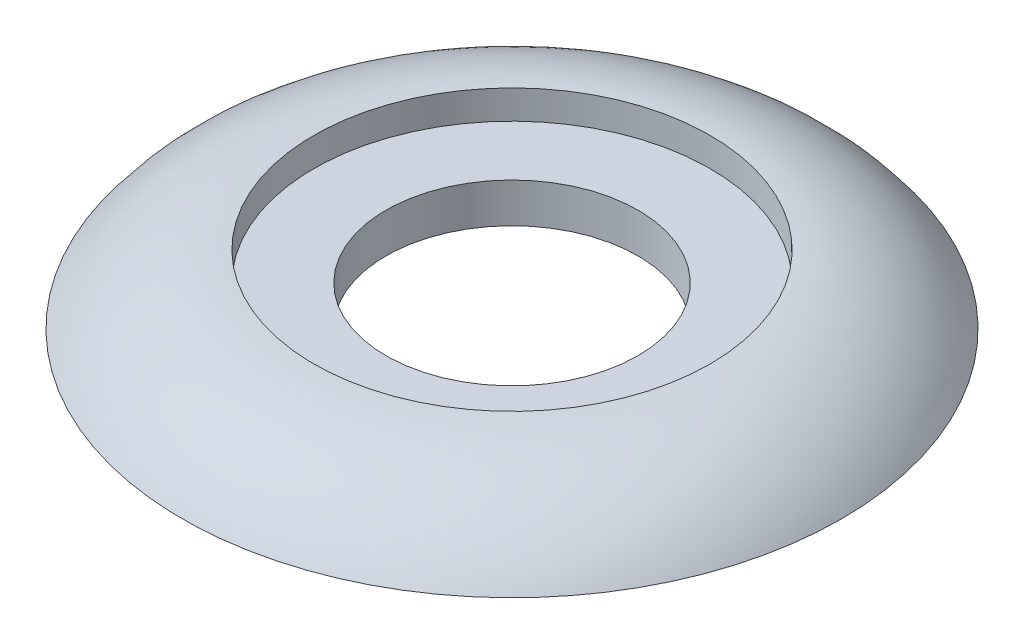
ISO-10303-21;
HEADER;
FILE_DESCRIPTION(('STEP AP214'),'2;1');
FILE_NAME('part.step','',(''),(''),'','','');
FILE_SCHEMA(('AUTOMOTIVE_DESIGN { 1 0 10303 214 1 1 1 1 }'));
ENDSEC;
DATA;
#1=APPLICATION_CONTEXT('core data for automotive mechanical design processes');
#2=APPLICATION_PROTOCOL_DEFINITION('international standard','automotive_design',2000,#1);
#3=PRODUCT_CONTEXT('',#1,'mechanical');
#4=PRODUCT('Part','Part','',(#3));
#5=PRODUCT_RELATED_PRODUCT_CATEGORY('part','',(#4));
#6=PRODUCT_DEFINITION_FORMATION('','',#4);
#7=PRODUCT_DEFINITION_CONTEXT('part definition',#1,'design');
#8=PRODUCT_DEFINITION('design','',#6,#7);
#9=PRODUCT_DEFINITION_SHAPE('','',#8);
#10=(LENGTH_UNIT() NAMED_UNIT(*) SI_UNIT(.MILLI.,.METRE.));
#11=(NAMED_UNIT(*) PLANE_ANGLE_UNIT() SI_UNIT($,.RADIAN.));
#12=(NAMED_UNIT(*) SI_UNIT($,.STERADIAN.) SOLID_ANGLE_UNIT());
#13=UNCERTAINTY_MEASURE_WITH_UNIT(LENGTH_MEASURE(1.E-05),#10,'distance_accuracy_value','');
#14=(GEOMETRIC_REPRESENTATION_CONTEXT(3) GLOBAL_UNCERTAINTY_ASSIGNED_CONTEXT((#13)) GLOBAL_UNIT_ASSIGNED_CONTEXT((#10,
#11,#12)) REPRESENTATION_CONTEXT('',''));
#15=CARTESIAN_POINT('',(0.,0.,0.));
#16=DIRECTION('',(0.,0.,1.));
#17=DIRECTION('',(1.,0.,0.));
#18=AXIS2_PLACEMENT_3D('',#15,#16,#17);
#19=CARTESIAN_POINT('',(1.36312068222548E-12,-397.382429866827,0.));
#20=DIRECTION('',(0.,-1.,0.));
#21=DIRECTION('',(1.,0.,0.));
#22=AXIS2_PLACEMENT_3D('',#19,#20,#21);
#23=CYLINDRICAL_SURFACE('',#22,4.445);
#24=CARTESIAN_POINT('',(0.,0.,0.));
#25=DIRECTION('',(0.,-1.,0.));
#26=DIRECTION('',(1.,0.,0.));
#27=AXIS2_PLACEMENT_3D('',#24,#25,#26);
#28=CIRCLE('',#27,4.445);
#29=CARTESIAN_POINT('',(4.445,0.,0.));
#30=VERTEX_POINT('',#29);
#31=EDGE_CURVE('E55',#30,#30,#28,.T.);
#32=ORIENTED_EDGE('',*,*,#31,.T.);
#33=EDGE_LOOP('',(#32));
#34=FACE_BOUND('',#33,.T.);
#35=CARTESIAN_POINT('',(0.,1.39699999999998,0.));
#36=DIRECTION('',(0.,-1.,0.));
#37=DIRECTION('',(1.,0.,0.));
#38=AXIS2_PLACEMENT_3D('',#35,#36,#37);
#39=CIRCLE('',#38,4.445);
#40=CARTESIAN_POINT('',(4.445,1.397,0.));
#41=VERTEX_POINT('',#40);
#42=EDGE_CURVE('E10',#41,#41,#39,.T.);
#43=ORIENTED_EDGE('',*,*,#42,.F.);
#44=EDGE_LOOP('',(#43));
#45=FACE_BOUND('',#44,.T.);
#46=ADVANCED_FACE('F36',(#34,#45),#23,.F.);
#47=CARTESIAN_POINT('',(4.445,1.397,0.));
#48=DIRECTION('',(0.,1.,0.));
#49=DIRECTION('',(-1.,0.,0.));
#50=AXIS2_PLACEMENT_3D('',#47,#48,#49);
#51=PLANE('',#50);
#52=ORIENTED_EDGE('',*,*,#42,.T.);
#53=EDGE_LOOP('',(#52));
#54=FACE_BOUND('',#53,.T.);
#55=CARTESIAN_POINT('',(0.,1.39699999999998,0.));
#56=DIRECTION('',(0.,-1.,0.));
#57=DIRECTION('',(1.,0.,0.));
#58=AXIS2_PLACEMENT_3D('',#55,#56,#57);
#59=CIRCLE('',#58,6.985);
#60=CARTESIAN_POINT('',(6.985,1.39700000000001,0.));
#61=VERTEX_POINT('',#60);
#62=EDGE_CURVE('E42',#61,#61,#59,.T.);
#63=ORIENTED_EDGE('',*,*,#62,.F.);
#64=EDGE_LOOP('',(#63));
#65=FACE_BOUND('',#64,.T.);
#66=ADVANCED_FACE('F73',(#54,#65),#51,.T.);
#67=CARTESIAN_POINT('',(1.36312068222548E-12,-397.382429866827,0.));
#68=DIRECTION('',(0.,-1.,0.));
#69=DIRECTION('',(1.,0.,0.));
#70=AXIS2_PLACEMENT_3D('',#67,#68,#69);
#71=CYLINDRICAL_SURFACE('',#70,6.98500000000001);
#72=ORIENTED_EDGE('',*,*,#62,.T.);
#73=EDGE_LOOP('',(#72));
#74=FACE_BOUND('',#73,.T.);
#75=CARTESIAN_POINT('',(0.,2.413,0.));
#76=DIRECTION('',(0.,-1.,0.));
#77=DIRECTION('',(1.,0.,0.));
#78=AXIS2_PLACEMENT_3D('',#75,#76,#77);
#79=CIRCLE('',#78,6.98500000000001);
#80=CARTESIAN_POINT('',(6.985,2.41300000000002,0.));
#81=VERTEX_POINT('',#80);
#82=EDGE_CURVE('E46',#81,#81,#79,.T.);
#83=ORIENTED_EDGE('',*,*,#82,.F.);
#84=EDGE_LOOP('',(#83));
#85=FACE_BOUND('',#84,.T.);
#86=ADVANCED_FACE('F69',(#74,#85),#71,.F.);
#87=CARTESIAN_POINT('',(0.,-3.24601973684211,0.));
#88=DIRECTION('',(0.,-1.,0.));
#89=DIRECTION('',(1.,0.,0.));
#90=AXIS2_PLACEMENT_3D('',#87,#88,#89);
#91=TOROIDAL_SURFACE('',#90,6.98499999999999,5.65901973684211);
#92=ORIENTED_EDGE('',*,*,#82,.T.);
#93=EDGE_LOOP('',(#92));
#94=FACE_BOUND('',#93,.T.);
#95=CARTESIAN_POINT('',(0.,0.,0.));
#96=DIRECTION('',(0.,-1.,0.));
#97=DIRECTION('',(1.,0.,0.));
#98=AXIS2_PLACEMENT_3D('',#95,#96,#97);
#99=CIRCLE('',#98,11.6205);
#100=CARTESIAN_POINT('',(11.6205,0.,0.));
#101=VERTEX_POINT('',#100);
#102=EDGE_CURVE('E50',#101,#101,#99,.T.);
#103=ORIENTED_EDGE('',*,*,#102,.F.);
#104=EDGE_LOOP('',(#103));
#105=FACE_BOUND('',#104,.T.);
#106=ADVANCED_FACE('F63',(#94,#105),#91,.T.);
#107=CARTESIAN_POINT('',(4.445,0.,0.));
#108=DIRECTION('',(0.,-1.,0.));
#109=DIRECTION('',(1.,0.,0.));
#110=AXIS2_PLACEMENT_3D('',#107,#108,#109);
#111=PLANE('',#110);
#112=ORIENTED_EDGE('',*,*,#102,.T.);
#113=EDGE_LOOP('',(#112));
#114=FACE_BOUND('',#113,.T.);
#115=ORIENTED_EDGE('',*,*,#31,.F.);
#116=EDGE_LOOP('',(#115));
#117=FACE_BOUND('',#116,.T.);
#118=ADVANCED_FACE('F61',(#114,#117),#111,.T.);
#119=CLOSED_SHELL('',(#46,#66,#86,#106,#118));
#120=MANIFOLD_SOLID_BREP('B2',#119);
#121=ADVANCED_BREP_SHAPE_REPRESENTATION('',(#18,#120),#14);
#122=SHAPE_DEFINITION_REPRESENTATION(#9,#121);
ENDSEC;
END-ISO-10303-21;
